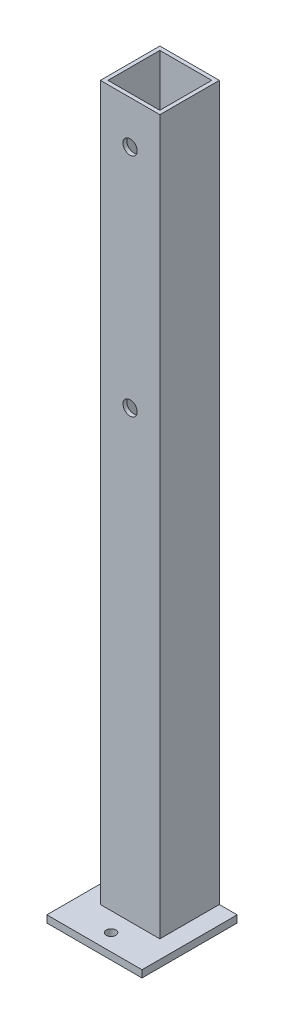
ISO-10303-21;
HEADER;
FILE_DESCRIPTION(('STEP AP214'),'2;1');
FILE_NAME('part.step','',(''),(''),'','','');
FILE_SCHEMA(('AUTOMOTIVE_DESIGN { 1 0 10303 214 1 1 1 1 }'));
ENDSEC;
DATA;
#1=APPLICATION_CONTEXT('core data for automotive mechanical design processes');
#2=APPLICATION_PROTOCOL_DEFINITION('international standard','automotive_design',2000,#1);
#3=PRODUCT_CONTEXT('',#1,'mechanical');
#4=PRODUCT('Part','Part','',(#3));
#5=PRODUCT_RELATED_PRODUCT_CATEGORY('part','',(#4));
#6=PRODUCT_DEFINITION_FORMATION('','',#4);
#7=PRODUCT_DEFINITION_CONTEXT('part definition',#1,'design');
#8=PRODUCT_DEFINITION('design','',#6,#7);
#9=PRODUCT_DEFINITION_SHAPE('','',#8);
#10=(LENGTH_UNIT() NAMED_UNIT(*) SI_UNIT(.MILLI.,.METRE.));
#11=(NAMED_UNIT(*) PLANE_ANGLE_UNIT() SI_UNIT($,.RADIAN.));
#12=(NAMED_UNIT(*) SI_UNIT($,.STERADIAN.) SOLID_ANGLE_UNIT());
#13=UNCERTAINTY_MEASURE_WITH_UNIT(LENGTH_MEASURE(1.E-05),#10,'distance_accuracy_value','');
#14=(GEOMETRIC_REPRESENTATION_CONTEXT(3) GLOBAL_UNCERTAINTY_ASSIGNED_CONTEXT((#13)) GLOBAL_UNIT_ASSIGNED_CONTEXT((#10,
#11,#12)) REPRESENTATION_CONTEXT('',''));
#15=CARTESIAN_POINT('',(0.,0.,0.));
#16=DIRECTION('',(0.,0.,1.));
#17=DIRECTION('',(1.,0.,0.));
#18=AXIS2_PLACEMENT_3D('',#15,#16,#17);
#19=CARTESIAN_POINT('',(-12.5,300.,12.5));
#20=DIRECTION('',(0.,1.,0.));
#21=DIRECTION('',(0.,0.,1.));
#22=AXIS2_PLACEMENT_3D('',#19,#20,#21);
#23=PLANE('',#22);
#24=DIRECTION('',(0.,0.,1.));
#25=VECTOR('',#24,1.);
#26=CARTESIAN_POINT('',(-12.5,300.,-12.5));
#27=LINE('',#26,#25);
#28=CARTESIAN_POINT('',(-12.5,300.,-12.5));
#29=VERTEX_POINT('',#28);
#30=CARTESIAN_POINT('',(-12.5,300.,12.5));
#31=VERTEX_POINT('',#30);
#32=EDGE_CURVE('E101',#29,#31,#27,.T.);
#33=ORIENTED_EDGE('',*,*,#32,.T.);
#34=DIRECTION('',(1.,0.,0.));
#35=VECTOR('',#34,1.);
#36=CARTESIAN_POINT('',(-12.5,300.,12.5));
#37=LINE('',#36,#35);
#38=CARTESIAN_POINT('',(12.5,300.,12.5));
#39=VERTEX_POINT('',#38);
#40=EDGE_CURVE('E94',#31,#39,#37,.T.);
#41=ORIENTED_EDGE('',*,*,#40,.T.);
#42=DIRECTION('',(0.,0.,-1.));
#43=VECTOR('',#42,1.);
#44=CARTESIAN_POINT('',(12.5,300.,-12.5));
#45=LINE('',#44,#43);
#46=CARTESIAN_POINT('',(12.5,300.,-12.5));
#47=VERTEX_POINT('',#46);
#48=EDGE_CURVE('E98',#39,#47,#45,.T.);
#49=ORIENTED_EDGE('',*,*,#48,.T.);
#50=DIRECTION('',(-1.,0.,0.));
#51=VECTOR('',#50,1.);
#52=CARTESIAN_POINT('',(-12.5,300.,-12.5));
#53=LINE('',#52,#51);
#54=EDGE_CURVE('E57',#47,#29,#53,.T.);
#55=ORIENTED_EDGE('',*,*,#54,.T.);
#56=EDGE_LOOP('',(#33,#41,#49,#55));
#57=FACE_BOUND('',#56,.T.);
#58=DIRECTION('',(1.,0.,0.));
#59=VECTOR('',#58,1.);
#60=CARTESIAN_POINT('',(-10.9,300.,10.9));
#61=LINE('',#60,#59);
#62=CARTESIAN_POINT('',(-10.9,300.,10.9));
#63=VERTEX_POINT('',#62);
#64=CARTESIAN_POINT('',(10.9,300.,10.9));
#65=VERTEX_POINT('',#64);
#66=EDGE_CURVE('E166',#63,#65,#61,.T.);
#67=ORIENTED_EDGE('',*,*,#66,.F.);
#68=DIRECTION('',(0.,0.,1.));
#69=VECTOR('',#68,1.);
#70=CARTESIAN_POINT('',(-10.9,300.,-10.9));
#71=LINE('',#70,#69);
#72=CARTESIAN_POINT('',(-10.9,300.,-10.9));
#73=VERTEX_POINT('',#72);
#74=EDGE_CURVE('E153',#73,#63,#71,.T.);
#75=ORIENTED_EDGE('',*,*,#74,.F.);
#76=DIRECTION('',(-1.,0.,0.));
#77=VECTOR('',#76,1.);
#78=CARTESIAN_POINT('',(-10.9,300.,-10.9));
#79=LINE('',#78,#77);
#80=CARTESIAN_POINT('',(10.9,300.,-10.9));
#81=VERTEX_POINT('',#80);
#82=EDGE_CURVE('E78',#81,#73,#79,.T.);
#83=ORIENTED_EDGE('',*,*,#82,.F.);
#84=DIRECTION('',(0.,0.,-1.));
#85=VECTOR('',#84,1.);
#86=CARTESIAN_POINT('',(10.9,300.,-10.9));
#87=LINE('',#86,#85);
#88=EDGE_CURVE('E164',#65,#81,#87,.T.);
#89=ORIENTED_EDGE('',*,*,#88,.F.);
#90=EDGE_LOOP('',(#67,#75,#83,#89));
#91=FACE_BOUND('',#90,.T.);
#92=ADVANCED_FACE('F31',(#57,#91),#23,.T.);
#93=CARTESIAN_POINT('',(-12.5,300.,-12.5));
#94=DIRECTION('',(1.,0.,0.));
#95=DIRECTION('',(0.,0.,-1.));
#96=AXIS2_PLACEMENT_3D('',#93,#94,#95);
#97=PLANE('',#96);
#98=DIRECTION('',(0.,0.,1.));
#99=VECTOR('',#98,1.);
#100=CARTESIAN_POINT('',(-12.5,0.,-12.5));
#101=LINE('',#100,#99);
#102=CARTESIAN_POINT('',(-12.5,0.,-12.5));
#103=VERTEX_POINT('',#102);
#104=CARTESIAN_POINT('',(-12.5,0.,12.5));
#105=VERTEX_POINT('',#104);
#106=EDGE_CURVE('E119',#103,#105,#101,.T.);
#107=ORIENTED_EDGE('',*,*,#106,.T.);
#108=DIRECTION('',(0.,-1.,0.));
#109=VECTOR('',#108,1.);
#110=CARTESIAN_POINT('',(-12.5,300.,12.5));
#111=LINE('',#110,#109);
#112=EDGE_CURVE('E11',#31,#105,#111,.T.);
#113=ORIENTED_EDGE('',*,*,#112,.F.);
#114=ORIENTED_EDGE('',*,*,#32,.F.);
#115=DIRECTION('',(0.,-1.,0.));
#116=VECTOR('',#115,1.);
#117=CARTESIAN_POINT('',(-12.5,300.,-12.5));
#118=LINE('',#117,#116);
#119=EDGE_CURVE('E114',#29,#103,#118,.T.);
#120=ORIENTED_EDGE('',*,*,#119,.T.);
#121=EDGE_LOOP('',(#107,#113,#114,#120));
#122=FACE_BOUND('',#121,.T.);
#123=ADVANCED_FACE('F33',(#122),#97,.F.);
#124=CARTESIAN_POINT('',(-12.5,300.,12.5));
#125=DIRECTION('',(0.,0.,-1.));
#126=DIRECTION('',(-1.,0.,0.));
#127=AXIS2_PLACEMENT_3D('',#124,#125,#126);
#128=PLANE('',#127);
#129=CARTESIAN_POINT('',(0.,282.,12.5));
#130=DIRECTION('',(0.,0.,1.));
#131=DIRECTION('',(1.,0.,0.));
#132=AXIS2_PLACEMENT_3D('',#129,#130,#131);
#133=CIRCLE('',#132,3.);
#134=CARTESIAN_POINT('',(3.,282.,12.5));
#135=VERTEX_POINT('',#134);
#136=EDGE_CURVE('E229',#135,#135,#133,.T.);
#137=ORIENTED_EDGE('',*,*,#136,.F.);
#138=EDGE_LOOP('',(#137));
#139=FACE_BOUND('',#138,.T.);
#140=CARTESIAN_POINT('',(0.,187.,12.5));
#141=DIRECTION('',(0.,0.,1.));
#142=DIRECTION('',(1.,0.,0.));
#143=AXIS2_PLACEMENT_3D('',#140,#141,#142);
#144=CIRCLE('',#143,3.);
#145=CARTESIAN_POINT('',(3.,187.,12.5));
#146=VERTEX_POINT('',#145);
#147=EDGE_CURVE('E213',#146,#146,#144,.T.);
#148=ORIENTED_EDGE('',*,*,#147,.F.);
#149=EDGE_LOOP('',(#148));
#150=FACE_BOUND('',#149,.T.);
#151=DIRECTION('',(1.,0.,0.));
#152=VECTOR('',#151,1.);
#153=CARTESIAN_POINT('',(-12.5,0.,12.5));
#154=LINE('',#153,#152);
#155=CARTESIAN_POINT('',(12.5,0.,12.5));
#156=VERTEX_POINT('',#155);
#157=EDGE_CURVE('E107',#105,#156,#154,.T.);
#158=ORIENTED_EDGE('',*,*,#157,.T.);
#159=DIRECTION('',(0.,-1.,0.));
#160=VECTOR('',#159,1.);
#161=CARTESIAN_POINT('',(12.5,300.,12.5));
#162=LINE('',#161,#160);
#163=EDGE_CURVE('E40',#39,#156,#162,.T.);
#164=ORIENTED_EDGE('',*,*,#163,.F.);
#165=ORIENTED_EDGE('',*,*,#40,.F.);
#166=ORIENTED_EDGE('',*,*,#112,.T.);
#167=EDGE_LOOP('',(#158,#164,#165,#166));
#168=FACE_BOUND('',#167,.T.);
#169=ADVANCED_FACE('F106',(#139,#150,#168),#128,.F.);
#170=CARTESIAN_POINT('',(12.5,300.,-12.5));
#171=DIRECTION('',(-1.,0.,0.));
#172=DIRECTION('',(0.,0.,1.));
#173=AXIS2_PLACEMENT_3D('',#170,#171,#172);
#174=PLANE('',#173);
#175=DIRECTION('',(0.,0.,-1.));
#176=VECTOR('',#175,1.);
#177=CARTESIAN_POINT('',(12.5,0.,-12.5));
#178=LINE('',#177,#176);
#179=CARTESIAN_POINT('',(12.5,0.,-12.5));
#180=VERTEX_POINT('',#179);
#181=EDGE_CURVE('E70',#156,#180,#178,.T.);
#182=ORIENTED_EDGE('',*,*,#181,.T.);
#183=DIRECTION('',(0.,-1.,0.));
#184=VECTOR('',#183,1.);
#185=CARTESIAN_POINT('',(12.5,300.,-12.5));
#186=LINE('',#185,#184);
#187=EDGE_CURVE('E109',#47,#180,#186,.T.);
#188=ORIENTED_EDGE('',*,*,#187,.F.);
#189=ORIENTED_EDGE('',*,*,#48,.F.);
#190=ORIENTED_EDGE('',*,*,#163,.T.);
#191=EDGE_LOOP('',(#182,#188,#189,#190));
#192=FACE_BOUND('',#191,.T.);
#193=ADVANCED_FACE('F111',(#192),#174,.F.);
#194=CARTESIAN_POINT('',(-12.5,300.,-12.5));
#195=DIRECTION('',(0.,0.,1.));
#196=DIRECTION('',(1.,0.,0.));
#197=AXIS2_PLACEMENT_3D('',#194,#195,#196);
#198=PLANE('',#197);
#199=ORIENTED_EDGE('',*,*,#187,.T.);
#200=DIRECTION('',(1.,0.,0.));
#201=VECTOR('',#200,1.);
#202=CARTESIAN_POINT('',(20.,0.,-12.5));
#203=LINE('',#202,#201);
#204=CARTESIAN_POINT('',(20.,0.,-12.5));
#205=VERTEX_POINT('',#204);
#206=EDGE_CURVE('E169',#180,#205,#203,.T.);
#207=ORIENTED_EDGE('',*,*,#206,.T.);
#208=DIRECTION('',(0.,1.,0.));
#209=VECTOR('',#208,1.);
#210=CARTESIAN_POINT('',(20.,-3.,-12.5));
#211=LINE('',#210,#209);
#212=CARTESIAN_POINT('',(20.,-3.,-12.5));
#213=VERTEX_POINT('',#212);
#214=EDGE_CURVE('E179',#213,#205,#211,.T.);
#215=ORIENTED_EDGE('',*,*,#214,.F.);
#216=DIRECTION('',(1.,0.,0.));
#217=VECTOR('',#216,1.);
#218=CARTESIAN_POINT('',(20.,-3.,-12.5));
#219=LINE('',#218,#217);
#220=CARTESIAN_POINT('',(-20.,-3.,-12.5));
#221=VERTEX_POINT('',#220);
#222=EDGE_CURVE('E184',#221,#213,#219,.T.);
#223=ORIENTED_EDGE('',*,*,#222,.F.);
#224=DIRECTION('',(0.,1.,0.));
#225=VECTOR('',#224,1.);
#226=CARTESIAN_POINT('',(-20.,-3.,-12.5));
#227=LINE('',#226,#225);
#228=CARTESIAN_POINT('',(-20.,0.,-12.5));
#229=VERTEX_POINT('',#228);
#230=EDGE_CURVE('E183',#221,#229,#227,.T.);
#231=ORIENTED_EDGE('',*,*,#230,.T.);
#232=EDGE_CURVE('E172',#229,#103,#203,.T.);
#233=ORIENTED_EDGE('',*,*,#232,.T.);
#234=ORIENTED_EDGE('',*,*,#119,.F.);
#235=ORIENTED_EDGE('',*,*,#54,.F.);
#236=EDGE_LOOP('',(#199,#207,#215,#223,#231,#233,#234,#235));
#237=FACE_BOUND('',#236,.T.);
#238=ADVANCED_FACE('F256',(#237),#198,.F.);
#239=CARTESIAN_POINT('',(-10.9,300.,-10.9));
#240=DIRECTION('',(1.,0.,0.));
#241=DIRECTION('',(0.,0.,-1.));
#242=AXIS2_PLACEMENT_3D('',#239,#240,#241);
#243=PLANE('',#242);
#244=DIRECTION('',(0.,0.,1.));
#245=VECTOR('',#244,1.);
#246=CARTESIAN_POINT('',(-10.9,0.,-10.9));
#247=LINE('',#246,#245);
#248=CARTESIAN_POINT('',(-10.9,0.,-10.9));
#249=VERTEX_POINT('',#248);
#250=CARTESIAN_POINT('',(-10.9,0.,10.9));
#251=VERTEX_POINT('',#250);
#252=EDGE_CURVE('E160',#249,#251,#247,.T.);
#253=ORIENTED_EDGE('',*,*,#252,.F.);
#254=DIRECTION('',(0.,-1.,0.));
#255=VECTOR('',#254,1.);
#256=CARTESIAN_POINT('',(-10.9,300.,-10.9));
#257=LINE('',#256,#255);
#258=EDGE_CURVE('E148',#73,#249,#257,.T.);
#259=ORIENTED_EDGE('',*,*,#258,.F.);
#260=ORIENTED_EDGE('',*,*,#74,.T.);
#261=DIRECTION('',(0.,-1.,0.));
#262=VECTOR('',#261,1.);
#263=CARTESIAN_POINT('',(-10.9,300.,10.9));
#264=LINE('',#263,#262);
#265=EDGE_CURVE('E135',#63,#251,#264,.T.);
#266=ORIENTED_EDGE('',*,*,#265,.T.);
#267=EDGE_LOOP('',(#253,#259,#260,#266));
#268=FACE_BOUND('',#267,.T.);
#269=ADVANCED_FACE('F278',(#268),#243,.T.);
#270=CARTESIAN_POINT('',(-10.9,300.,10.9));
#271=DIRECTION('',(0.,0.,-1.));
#272=DIRECTION('',(-1.,0.,0.));
#273=AXIS2_PLACEMENT_3D('',#270,#271,#272);
#274=PLANE('',#273);
#275=CARTESIAN_POINT('',(0.,282.,10.9));
#276=DIRECTION('',(0.,0.,-1.));
#277=DIRECTION('',(-1.,0.,0.));
#278=AXIS2_PLACEMENT_3D('',#275,#276,#277);
#279=CIRCLE('',#278,3.);
#280=CARTESIAN_POINT('',(-3.,282.,10.9));
#281=VERTEX_POINT('',#280);
#282=EDGE_CURVE('E232',#281,#281,#279,.F.);
#283=ORIENTED_EDGE('',*,*,#282,.T.);
#284=EDGE_LOOP('',(#283));
#285=FACE_BOUND('',#284,.T.);
#286=CARTESIAN_POINT('',(0.,187.,10.9));
#287=DIRECTION('',(0.,0.,-1.));
#288=DIRECTION('',(-1.,0.,0.));
#289=AXIS2_PLACEMENT_3D('',#286,#287,#288);
#290=CIRCLE('',#289,3.);
#291=CARTESIAN_POINT('',(-3.,187.,10.9));
#292=VERTEX_POINT('',#291);
#293=EDGE_CURVE('E216',#292,#292,#290,.F.);
#294=ORIENTED_EDGE('',*,*,#293,.T.);
#295=EDGE_LOOP('',(#294));
#296=FACE_BOUND('',#295,.T.);
#297=DIRECTION('',(1.,0.,0.));
#298=VECTOR('',#297,1.);
#299=CARTESIAN_POINT('',(-10.9,0.,10.9));
#300=LINE('',#299,#298);
#301=CARTESIAN_POINT('',(10.9,0.,10.9));
#302=VERTEX_POINT('',#301);
#303=EDGE_CURVE('E157',#251,#302,#300,.T.);
#304=ORIENTED_EDGE('',*,*,#303,.F.);
#305=ORIENTED_EDGE('',*,*,#265,.F.);
#306=ORIENTED_EDGE('',*,*,#66,.T.);
#307=DIRECTION('',(0.,-1.,0.));
#308=VECTOR('',#307,1.);
#309=CARTESIAN_POINT('',(10.9,300.,10.9));
#310=LINE('',#309,#308);
#311=EDGE_CURVE('E138',#65,#302,#310,.T.);
#312=ORIENTED_EDGE('',*,*,#311,.T.);
#313=EDGE_LOOP('',(#304,#305,#306,#312));
#314=FACE_BOUND('',#313,.T.);
#315=ADVANCED_FACE('F281',(#285,#296,#314),#274,.T.);
#316=CARTESIAN_POINT('',(10.9,300.,-10.9));
#317=DIRECTION('',(-1.,0.,0.));
#318=DIRECTION('',(0.,0.,1.));
#319=AXIS2_PLACEMENT_3D('',#316,#317,#318);
#320=PLANE('',#319);
#321=DIRECTION('',(0.,0.,-1.));
#322=VECTOR('',#321,1.);
#323=CARTESIAN_POINT('',(10.9,0.,-10.9));
#324=LINE('',#323,#322);
#325=CARTESIAN_POINT('',(10.9,0.,-10.9));
#326=VERTEX_POINT('',#325);
#327=EDGE_CURVE('E154',#302,#326,#324,.T.);
#328=ORIENTED_EDGE('',*,*,#327,.F.);
#329=ORIENTED_EDGE('',*,*,#311,.F.);
#330=ORIENTED_EDGE('',*,*,#88,.T.);
#331=DIRECTION('',(0.,-1.,0.));
#332=VECTOR('',#331,1.);
#333=CARTESIAN_POINT('',(10.9,300.,-10.9));
#334=LINE('',#333,#332);
#335=EDGE_CURVE('E48',#81,#326,#334,.T.);
#336=ORIENTED_EDGE('',*,*,#335,.T.);
#337=EDGE_LOOP('',(#328,#329,#330,#336));
#338=FACE_BOUND('',#337,.T.);
#339=ADVANCED_FACE('F286',(#338),#320,.T.);
#340=CARTESIAN_POINT('',(-10.9,300.,-10.9));
#341=DIRECTION('',(0.,0.,1.));
#342=DIRECTION('',(1.,0.,0.));
#343=AXIS2_PLACEMENT_3D('',#340,#341,#342);
#344=PLANE('',#343);
#345=DIRECTION('',(-1.,0.,0.));
#346=VECTOR('',#345,1.);
#347=CARTESIAN_POINT('',(-10.9,0.,-10.9));
#348=LINE('',#347,#346);
#349=EDGE_CURVE('E150',#326,#249,#348,.T.);
#350=ORIENTED_EDGE('',*,*,#349,.F.);
#351=ORIENTED_EDGE('',*,*,#335,.F.);
#352=ORIENTED_EDGE('',*,*,#82,.T.);
#353=ORIENTED_EDGE('',*,*,#258,.T.);
#354=EDGE_LOOP('',(#350,#351,#352,#353));
#355=FACE_BOUND('',#354,.T.);
#356=ADVANCED_FACE('F288',(#355),#344,.T.);
#357=CARTESIAN_POINT('',(20.,0.,27.5));
#358=DIRECTION('',(0.,-1.,0.));
#359=DIRECTION('',(0.,0.,-1.));
#360=AXIS2_PLACEMENT_3D('',#357,#358,#359);
#361=PLANE('',#360);
#362=ORIENTED_EDGE('',*,*,#349,.T.);
#363=ORIENTED_EDGE('',*,*,#252,.T.);
#364=ORIENTED_EDGE('',*,*,#303,.T.);
#365=ORIENTED_EDGE('',*,*,#327,.T.);
#366=EDGE_LOOP('',(#362,#363,#364,#365));
#367=FACE_BOUND('',#366,.T.);
#368=ADVANCED_FACE('F249',(#367),#361,.F.);
#369=CARTESIAN_POINT('',(20.,-3.,-12.5));
#370=DIRECTION('',(-1.,0.,0.));
#371=DIRECTION('',(0.,0.,1.));
#372=AXIS2_PLACEMENT_3D('',#369,#370,#371);
#373=PLANE('',#372);
#374=DIRECTION('',(0.,0.,1.));
#375=VECTOR('',#374,1.);
#376=CARTESIAN_POINT('',(20.,0.,-12.5));
#377=LINE('',#376,#375);
#378=CARTESIAN_POINT('',(20.,0.,27.5));
#379=VERTEX_POINT('',#378);
#380=EDGE_CURVE('E209',#205,#379,#377,.T.);
#381=ORIENTED_EDGE('',*,*,#380,.T.);
#382=DIRECTION('',(0.,1.,0.));
#383=VECTOR('',#382,1.);
#384=CARTESIAN_POINT('',(20.,-3.,27.5));
#385=LINE('',#384,#383);
#386=CARTESIAN_POINT('',(20.,-3.,27.5));
#387=VERTEX_POINT('',#386);
#388=EDGE_CURVE('E162',#387,#379,#385,.T.);
#389=ORIENTED_EDGE('',*,*,#388,.F.);
#390=DIRECTION('',(0.,0.,1.));
#391=VECTOR('',#390,1.);
#392=CARTESIAN_POINT('',(20.,-3.,-12.5));
#393=LINE('',#392,#391);
#394=EDGE_CURVE('E225',#213,#387,#393,.T.);
#395=ORIENTED_EDGE('',*,*,#394,.F.);
#396=ORIENTED_EDGE('',*,*,#214,.T.);
#397=EDGE_LOOP('',(#381,#389,#395,#396));
#398=FACE_BOUND('',#397,.T.);
#399=ADVANCED_FACE('F210',(#398),#373,.F.);
#400=CARTESIAN_POINT('',(20.,-3.,27.5));
#401=DIRECTION('',(0.,0.,-1.));
#402=DIRECTION('',(-1.,0.,0.));
#403=AXIS2_PLACEMENT_3D('',#400,#401,#402);
#404=PLANE('',#403);
#405=DIRECTION('',(-1.,0.,0.));
#406=VECTOR('',#405,1.);
#407=CARTESIAN_POINT('',(20.,0.,27.5));
#408=LINE('',#407,#406);
#409=CARTESIAN_POINT('',(-20.,0.,27.5));
#410=VERTEX_POINT('',#409);
#411=EDGE_CURVE('E200',#379,#410,#408,.T.);
#412=ORIENTED_EDGE('',*,*,#411,.T.);
#413=DIRECTION('',(0.,1.,0.));
#414=VECTOR('',#413,1.);
#415=CARTESIAN_POINT('',(-20.,-3.,27.5));
#416=LINE('',#415,#414);
#417=CARTESIAN_POINT('',(-20.,-3.,27.5));
#418=VERTEX_POINT('',#417);
#419=EDGE_CURVE('E187',#418,#410,#416,.T.);
#420=ORIENTED_EDGE('',*,*,#419,.F.);
#421=DIRECTION('',(-1.,0.,0.));
#422=VECTOR('',#421,1.);
#423=CARTESIAN_POINT('',(20.,-3.,27.5));
#424=LINE('',#423,#422);
#425=EDGE_CURVE('E203',#387,#418,#424,.T.);
#426=ORIENTED_EDGE('',*,*,#425,.F.);
#427=ORIENTED_EDGE('',*,*,#388,.T.);
#428=EDGE_LOOP('',(#412,#420,#426,#427));
#429=FACE_BOUND('',#428,.T.);
#430=ADVANCED_FACE('F196',(#429),#404,.F.);
#431=CARTESIAN_POINT('',(-20.,-3.,-12.5));
#432=DIRECTION('',(1.,0.,0.));
#433=DIRECTION('',(0.,0.,-1.));
#434=AXIS2_PLACEMENT_3D('',#431,#432,#433);
#435=PLANE('',#434);
#436=DIRECTION('',(0.,0.,-1.));
#437=VECTOR('',#436,1.);
#438=CARTESIAN_POINT('',(-20.,0.,-12.5));
#439=LINE('',#438,#437);
#440=EDGE_CURVE('E173',#410,#229,#439,.T.);
#441=ORIENTED_EDGE('',*,*,#440,.T.);
#442=ORIENTED_EDGE('',*,*,#230,.F.);
#443=DIRECTION('',(0.,0.,-1.));
#444=VECTOR('',#443,1.);
#445=CARTESIAN_POINT('',(-20.,-3.,-12.5));
#446=LINE('',#445,#444);
#447=EDGE_CURVE('E221',#418,#221,#446,.T.);
#448=ORIENTED_EDGE('',*,*,#447,.F.);
#449=ORIENTED_EDGE('',*,*,#419,.T.);
#450=EDGE_LOOP('',(#441,#442,#448,#449));
#451=FACE_BOUND('',#450,.T.);
#452=ADVANCED_FACE('F264',(#451),#435,.F.);
#453=CARTESIAN_POINT('',(20.,-3.,27.5));
#454=DIRECTION('',(0.,-1.,0.));
#455=DIRECTION('',(0.,0.,-1.));
#456=AXIS2_PLACEMENT_3D('',#453,#454,#455);
#457=PLANE('',#456);
#458=CARTESIAN_POINT('',(0.,-3.,20.5));
#459=DIRECTION('',(0.,-1.,0.));
#460=DIRECTION('',(0.,0.,-1.));
#461=AXIS2_PLACEMENT_3D('',#458,#459,#460);
#462=CIRCLE('',#461,2.);
#463=CARTESIAN_POINT('',(0.,-3.,22.5));
#464=VERTEX_POINT('',#463);
#465=EDGE_CURVE('E236',#464,#464,#462,.F.);
#466=ORIENTED_EDGE('',*,*,#465,.T.);
#467=EDGE_LOOP('',(#466));
#468=FACE_BOUND('',#467,.T.);
#469=ORIENTED_EDGE('',*,*,#394,.T.);
#470=ORIENTED_EDGE('',*,*,#425,.T.);
#471=ORIENTED_EDGE('',*,*,#447,.T.);
#472=ORIENTED_EDGE('',*,*,#222,.T.);
#473=EDGE_LOOP('',(#469,#470,#471,#472));
#474=FACE_BOUND('',#473,.T.);
#475=ADVANCED_FACE('F247',(#468,#474),#457,.T.);
#476=CARTESIAN_POINT('',(0.,0.,20.5));
#477=DIRECTION('',(0.,1.,0.));
#478=DIRECTION('',(0.,0.,1.));
#479=AXIS2_PLACEMENT_3D('',#476,#477,#478);
#480=CIRCLE('',#479,2.);
#481=CARTESIAN_POINT('',(0.,0.,22.5));
#482=VERTEX_POINT('',#481);
#483=EDGE_CURVE('E235',#482,#482,#480,.T.);
#484=ORIENTED_EDGE('',*,*,#483,.F.);
#485=EDGE_LOOP('',(#484));
#486=FACE_BOUND('',#485,.T.);
#487=ORIENTED_EDGE('',*,*,#106,.F.);
#488=ORIENTED_EDGE('',*,*,#232,.F.);
#489=ORIENTED_EDGE('',*,*,#440,.F.);
#490=ORIENTED_EDGE('',*,*,#411,.F.);
#491=ORIENTED_EDGE('',*,*,#380,.F.);
#492=ORIENTED_EDGE('',*,*,#206,.F.);
#493=ORIENTED_EDGE('',*,*,#181,.F.);
#494=ORIENTED_EDGE('',*,*,#157,.F.);
#495=EDGE_LOOP('',(#487,#488,#489,#490,#491,#492,#493,#494));
#496=FACE_BOUND('',#495,.T.);
#497=ADVANCED_FACE('F244',(#486,#496),#361,.F.);
#498=CARTESIAN_POINT('',(0.,187.,-12.50105));
#499=DIRECTION('',(0.,0.,1.));
#500=DIRECTION('',(1.,0.,0.));
#501=AXIS2_PLACEMENT_3D('',#498,#499,#500);
#502=CYLINDRICAL_SURFACE('',#501,3.);
#503=ORIENTED_EDGE('',*,*,#293,.F.);
#504=EDGE_LOOP('',(#503));
#505=FACE_BOUND('',#504,.T.);
#506=ORIENTED_EDGE('',*,*,#147,.T.);
#507=EDGE_LOOP('',(#506));
#508=FACE_BOUND('',#507,.T.);
#509=ADVANCED_FACE('F246',(#505,#508),#502,.F.);
#510=CARTESIAN_POINT('',(0.,282.,-12.50105));
#511=DIRECTION('',(0.,0.,1.));
#512=DIRECTION('',(1.,0.,0.));
#513=AXIS2_PLACEMENT_3D('',#510,#511,#512);
#514=CYLINDRICAL_SURFACE('',#513,3.);
#515=ORIENTED_EDGE('',*,*,#282,.F.);
#516=EDGE_LOOP('',(#515));
#517=FACE_BOUND('',#516,.T.);
#518=ORIENTED_EDGE('',*,*,#136,.T.);
#519=EDGE_LOOP('',(#518));
#520=FACE_BOUND('',#519,.T.);
#521=ADVANCED_FACE('F321',(#517,#520),#514,.F.);
#522=CARTESIAN_POINT('',(0.,-3.001,20.5));
#523=DIRECTION('',(0.,1.,0.));
#524=DIRECTION('',(0.,0.,1.));
#525=AXIS2_PLACEMENT_3D('',#522,#523,#524);
#526=CYLINDRICAL_SURFACE('',#525,2.);
#527=CARTESIAN_POINT('',(0.,-3.,22.5));
#528=CARTESIAN_POINT('',(0.,-2.96875,22.5));
#529=CARTESIAN_POINT('',(0.,-2.9375,22.5));
#530=CARTESIAN_POINT('',(0.,-2.875,22.5));
#531=CARTESIAN_POINT('',(0.,-2.84375,22.5));
#532=CARTESIAN_POINT('',(0.,-2.78125,22.5));
#533=CARTESIAN_POINT('',(0.,-2.75,22.5));
#534=CARTESIAN_POINT('',(0.,-2.6875,22.5));
#535=CARTESIAN_POINT('',(0.,-2.65625,22.5));
#536=CARTESIAN_POINT('',(0.,-2.59375,22.5));
#537=CARTESIAN_POINT('',(0.,-2.5625,22.5));
#538=CARTESIAN_POINT('',(0.,-2.5,22.5));
#539=CARTESIAN_POINT('',(0.,-2.46875,22.5));
#540=CARTESIAN_POINT('',(0.,-2.40625,22.5));
#541=CARTESIAN_POINT('',(0.,-2.375,22.5));
#542=CARTESIAN_POINT('',(0.,-2.3125,22.5));
#543=CARTESIAN_POINT('',(0.,-2.28125,22.5));
#544=CARTESIAN_POINT('',(0.,-2.21875,22.5));
#545=CARTESIAN_POINT('',(0.,-2.1875,22.5));
#546=CARTESIAN_POINT('',(0.,-2.125,22.5));
#547=CARTESIAN_POINT('',(0.,-2.09375,22.5));
#548=CARTESIAN_POINT('',(0.,-2.03125,22.5));
#549=CARTESIAN_POINT('',(0.,-2.,22.5));
#550=CARTESIAN_POINT('',(0.,-1.9375,22.5));
#551=CARTESIAN_POINT('',(0.,-1.90625,22.5));
#552=CARTESIAN_POINT('',(0.,-1.84375,22.5));
#553=CARTESIAN_POINT('',(0.,-1.8125,22.5));
#554=CARTESIAN_POINT('',(0.,-1.75,22.5));
#555=CARTESIAN_POINT('',(0.,-1.71875,22.5));
#556=CARTESIAN_POINT('',(0.,-1.65625,22.5));
#557=CARTESIAN_POINT('',(0.,-1.625,22.5));
#558=CARTESIAN_POINT('',(0.,-1.5625,22.5));
#559=CARTESIAN_POINT('',(0.,-1.53125,22.5));
#560=CARTESIAN_POINT('',(0.,-1.46875,22.5));
#561=CARTESIAN_POINT('',(0.,-1.4375,22.5));
#562=CARTESIAN_POINT('',(0.,-1.375,22.5));
#563=CARTESIAN_POINT('',(0.,-1.34375,22.5));
#564=CARTESIAN_POINT('',(0.,-1.28125,22.5));
#565=CARTESIAN_POINT('',(0.,-1.25,22.5));
#566=CARTESIAN_POINT('',(0.,-1.1875,22.5));
#567=CARTESIAN_POINT('',(0.,-1.15625,22.5));
#568=CARTESIAN_POINT('',(0.,-1.09375,22.5));
#569=CARTESIAN_POINT('',(0.,-1.0625,22.5));
#570=CARTESIAN_POINT('',(0.,-1.,22.5));
#571=CARTESIAN_POINT('',(0.,-0.96875,22.5));
#572=CARTESIAN_POINT('',(0.,-0.90625,22.5));
#573=CARTESIAN_POINT('',(0.,-0.875,22.5));
#574=CARTESIAN_POINT('',(0.,-0.8125,22.5));
#575=CARTESIAN_POINT('',(0.,-0.78125,22.5));
#576=CARTESIAN_POINT('',(0.,-0.71875,22.5));
#577=CARTESIAN_POINT('',(0.,-0.6875,22.5));
#578=CARTESIAN_POINT('',(0.,-0.625,22.5));
#579=CARTESIAN_POINT('',(0.,-0.59375,22.5));
#580=CARTESIAN_POINT('',(0.,-0.53125,22.5));
#581=CARTESIAN_POINT('',(0.,-0.5,22.5));
#582=CARTESIAN_POINT('',(0.,-0.4375,22.5));
#583=CARTESIAN_POINT('',(0.,-0.40625,22.5));
#584=CARTESIAN_POINT('',(0.,-0.34375,22.5));
#585=CARTESIAN_POINT('',(0.,-0.3125,22.5));
#586=CARTESIAN_POINT('',(0.,-0.25,22.5));
#587=CARTESIAN_POINT('',(0.,-0.21875,22.5));
#588=CARTESIAN_POINT('',(0.,-0.156250000000001,22.5));
#589=CARTESIAN_POINT('',(0.,-0.125000000000001,22.5));
#590=CARTESIAN_POINT('',(0.,-0.0625000000000005,22.5));
#591=CARTESIAN_POINT('',(0.,-0.0312500000000005,22.5));
#592=CARTESIAN_POINT('',(0.,0.,22.5));
#593=B_SPLINE_CURVE_WITH_KNOTS('',3,(#527,#528,#529,#530,#531,#532,#533,#534,#535,#536,#537,
#538,#539,#540,#541,#542,#543,#544,#545,#546,#547,#548,#549,#550,#551,#552,#553,#554,#555,#556,
#557,#558,#559,#560,#561,#562,#563,#564,#565,#566,#567,#568,#569,#570,#571,#572,#573,#574,#575,
#576,#577,#578,#579,#580,#581,#582,#583,#584,#585,#586,#587,#588,#589,#590,#591,#592),
.UNSPECIFIED.,.F.,.F.,(4,2,2,2,2,2,2,2,2,2,2,2,2,2,2,2,2,2,2,2,2,2,2,2,2,2,2,2,2,2,2,2,4),(0.,
0.0937499999999997,0.1875,0.28125,0.375,0.46875,0.5625,0.65625,0.749999999999999,
0.843749999999999,0.9375,1.03125,1.125,1.21875,1.3125,1.40625,1.5,1.59375,1.6875,1.78125,1.875,
1.96875,2.0625,2.15625,2.25,2.34375,2.4375,2.53125,2.625,2.71875,2.8125,2.90625,3.),.UNSPECIFIED.);
#594=EDGE_CURVE('BSEAM242',#464,#482,#593,.T.);
#595=ORIENTED_EDGE('',*,*,#465,.F.);
#596=ORIENTED_EDGE('',*,*,#483,.T.);
#597=ORIENTED_EDGE('',*,*,#594,.T.);
#598=ORIENTED_EDGE('',*,*,#594,.F.);
#599=EDGE_LOOP('',(#595,#597,#596,#598));
#600=FACE_BOUND('',#599,.T.);
#601=ADVANCED_FACE('F242',(#600),#526,.F.);
#602=CLOSED_SHELL('',(#92,#123,#169,#193,#238,#269,#315,#339,#356,#368,#399,#430,#452,#475,#497,
#509,#521,#601));
#603=MANIFOLD_SOLID_BREP('B2',#602);
#604=ADVANCED_BREP_SHAPE_REPRESENTATION('',(#18,#603),#14);
#605=SHAPE_DEFINITION_REPRESENTATION(#9,#604);
ENDSEC;
END-ISO-10303-21;
